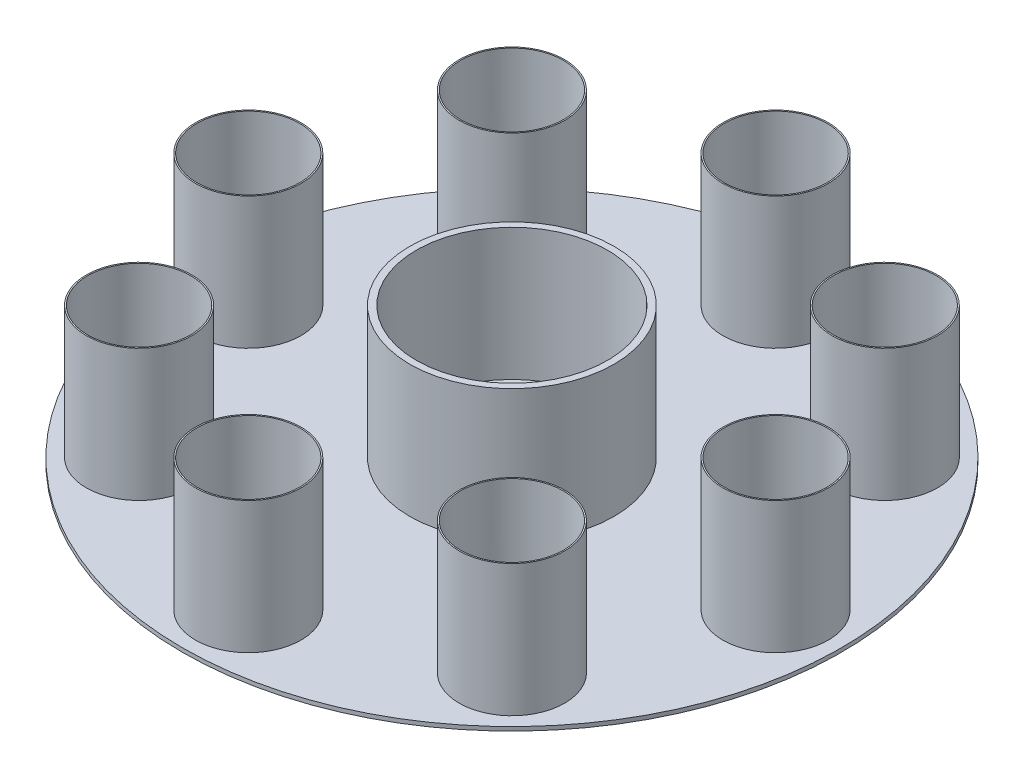
ISO-10303-21;
HEADER;
FILE_DESCRIPTION(('STEP AP214'),'2;1');
FILE_NAME('part.step','',(''),(''),'','','');
FILE_SCHEMA(('AUTOMOTIVE_DESIGN { 1 0 10303 214 1 1 1 1 }'));
ENDSEC;
DATA;
#1=APPLICATION_CONTEXT('core data for automotive mechanical design processes');
#2=APPLICATION_PROTOCOL_DEFINITION('international standard','automotive_design',2000,#1);
#3=PRODUCT_CONTEXT('',#1,'mechanical');
#4=PRODUCT('Part','Part','',(#3));
#5=PRODUCT_RELATED_PRODUCT_CATEGORY('part','',(#4));
#6=PRODUCT_DEFINITION_FORMATION('','',#4);
#7=PRODUCT_DEFINITION_CONTEXT('part definition',#1,'design');
#8=PRODUCT_DEFINITION('design','',#6,#7);
#9=PRODUCT_DEFINITION_SHAPE('','',#8);
#10=(LENGTH_UNIT() NAMED_UNIT(*) SI_UNIT(.MILLI.,.METRE.));
#11=(NAMED_UNIT(*) PLANE_ANGLE_UNIT() SI_UNIT($,.RADIAN.));
#12=(NAMED_UNIT(*) SI_UNIT($,.STERADIAN.) SOLID_ANGLE_UNIT());
#13=UNCERTAINTY_MEASURE_WITH_UNIT(LENGTH_MEASURE(1.E-05),#10,'distance_accuracy_value','');
#14=(GEOMETRIC_REPRESENTATION_CONTEXT(3) GLOBAL_UNCERTAINTY_ASSIGNED_CONTEXT((#13)) GLOBAL_UNIT_ASSIGNED_CONTEXT((#10,
#11,#12)) REPRESENTATION_CONTEXT('',''));
#15=CARTESIAN_POINT('',(0.,0.,0.));
#16=DIRECTION('',(0.,0.,1.));
#17=DIRECTION('',(1.,0.,0.));
#18=AXIS2_PLACEMENT_3D('',#15,#16,#17);
#19=CARTESIAN_POINT('',(0.,3.,0.));
#20=DIRECTION('',(0.,1.,0.));
#21=DIRECTION('',(0.,0.,1.));
#22=AXIS2_PLACEMENT_3D('',#19,#20,#21);
#23=PLANE('',#22);
#24=CARTESIAN_POINT('',(0.,3.,0.));
#25=DIRECTION('',(0.,1.,0.));
#26=DIRECTION('',(0.,0.,1.));
#27=AXIS2_PLACEMENT_3D('',#24,#25,#26);
#28=CIRCLE('',#27,77.5);
#29=CARTESIAN_POINT('',(0.,3.,77.5));
#30=VERTEX_POINT('',#29);
#31=EDGE_CURVE('E149',#30,#30,#28,.T.);
#32=ORIENTED_EDGE('',*,*,#31,.F.);
#33=EDGE_LOOP('',(#32));
#34=FACE_BOUND('',#33,.T.);
#35=CARTESIAN_POINT('',(-200.,3.,6.66133814775094E-13));
#36=DIRECTION('',(0.,1.,0.));
#37=DIRECTION('',(0.,0.,1.));
#38=AXIS2_PLACEMENT_3D('',#35,#36,#37);
#39=CIRCLE('',#38,40.);
#40=CARTESIAN_POINT('',(-200.,3.,40.0000000000007));
#41=VERTEX_POINT('',#40);
#42=EDGE_CURVE('E131',#41,#41,#39,.T.);
#43=ORIENTED_EDGE('',*,*,#42,.F.);
#44=EDGE_LOOP('',(#43));
#45=FACE_BOUND('',#44,.T.);
#46=CARTESIAN_POINT('',(1.38777878078145E-12,3.,200.));
#47=DIRECTION('',(0.,1.,0.));
#48=DIRECTION('',(0.,0.,1.));
#49=AXIS2_PLACEMENT_3D('',#46,#47,#48);
#50=CIRCLE('',#49,40.);
#51=CARTESIAN_POINT('',(1.38777878078145E-12,3.,240.));
#52=VERTEX_POINT('',#51);
#53=EDGE_CURVE('E113',#52,#52,#50,.T.);
#54=ORIENTED_EDGE('',*,*,#53,.F.);
#55=EDGE_LOOP('',(#54));
#56=FACE_BOUND('',#55,.T.);
#57=CARTESIAN_POINT('',(200.,3.,6.66133814775094E-13));
#58=DIRECTION('',(0.,1.,0.));
#59=DIRECTION('',(0.,0.,1.));
#60=AXIS2_PLACEMENT_3D('',#57,#58,#59);
#61=CIRCLE('',#60,40.);
#62=CARTESIAN_POINT('',(200.,3.,40.0000000000007));
#63=VERTEX_POINT('',#62);
#64=EDGE_CURVE('E95',#63,#63,#61,.T.);
#65=ORIENTED_EDGE('',*,*,#64,.F.);
#66=EDGE_LOOP('',(#65));
#67=FACE_BOUND('',#66,.T.);
#68=CARTESIAN_POINT('',(0.,3.,-200.));
#69=DIRECTION('',(0.,1.,0.));
#70=DIRECTION('',(0.,0.,1.));
#71=AXIS2_PLACEMENT_3D('',#68,#69,#70);
#72=CIRCLE('',#71,40.);
#73=CARTESIAN_POINT('',(0.,3.,-160.));
#74=VERTEX_POINT('',#73);
#75=EDGE_CURVE('E77',#74,#74,#72,.T.);
#76=ORIENTED_EDGE('',*,*,#75,.F.);
#77=EDGE_LOOP('',(#76));
#78=FACE_BOUND('',#77,.T.);
#79=CARTESIAN_POINT('',(0.,3.,0.));
#80=DIRECTION('',(0.,1.,0.));
#81=DIRECTION('',(0.,0.,1.));
#82=AXIS2_PLACEMENT_3D('',#79,#80,#81);
#83=CIRCLE('',#82,250.);
#84=CARTESIAN_POINT('',(0.,3.,250.));
#85=VERTEX_POINT('',#84);
#86=EDGE_CURVE('E42',#85,#85,#83,.T.);
#87=ORIENTED_EDGE('',*,*,#86,.T.);
#88=EDGE_LOOP('',(#87));
#89=FACE_BOUND('',#88,.T.);
#90=CARTESIAN_POINT('',(141.42135623731,3.,-141.421356237309));
#91=DIRECTION('',(0.,1.,0.));
#92=DIRECTION('',(0.,0.,1.));
#93=AXIS2_PLACEMENT_3D('',#90,#91,#92);
#94=CIRCLE('',#93,40.);
#95=CARTESIAN_POINT('',(141.42135623731,3.,-101.421356237309));
#96=VERTEX_POINT('',#95);
#97=EDGE_CURVE('E86',#96,#96,#94,.T.);
#98=ORIENTED_EDGE('',*,*,#97,.F.);
#99=EDGE_LOOP('',(#98));
#100=FACE_BOUND('',#99,.T.);
#101=CARTESIAN_POINT('',(141.42135623731,3.,141.421356237309));
#102=DIRECTION('',(0.,1.,0.));
#103=DIRECTION('',(0.,0.,1.));
#104=AXIS2_PLACEMENT_3D('',#101,#102,#103);
#105=CIRCLE('',#104,40.);
#106=CARTESIAN_POINT('',(141.42135623731,3.,181.421356237309));
#107=VERTEX_POINT('',#106);
#108=EDGE_CURVE('E104',#107,#107,#105,.T.);
#109=ORIENTED_EDGE('',*,*,#108,.F.);
#110=EDGE_LOOP('',(#109));
#111=FACE_BOUND('',#110,.T.);
#112=CARTESIAN_POINT('',(-141.42135623731,3.,141.421356237309));
#113=DIRECTION('',(0.,1.,0.));
#114=DIRECTION('',(0.,0.,1.));
#115=AXIS2_PLACEMENT_3D('',#112,#113,#114);
#116=CIRCLE('',#115,40.);
#117=CARTESIAN_POINT('',(-141.42135623731,3.,181.421356237309));
#118=VERTEX_POINT('',#117);
#119=EDGE_CURVE('E122',#118,#118,#116,.T.);
#120=ORIENTED_EDGE('',*,*,#119,.F.);
#121=EDGE_LOOP('',(#120));
#122=FACE_BOUND('',#121,.T.);
#123=CARTESIAN_POINT('',(-141.42135623731,3.,-141.421356237309));
#124=DIRECTION('',(0.,1.,0.));
#125=DIRECTION('',(0.,0.,1.));
#126=AXIS2_PLACEMENT_3D('',#123,#124,#125);
#127=CIRCLE('',#126,40.);
#128=CARTESIAN_POINT('',(-141.42135623731,3.,-101.421356237309));
#129=VERTEX_POINT('',#128);
#130=EDGE_CURVE('E140',#129,#129,#127,.T.);
#131=ORIENTED_EDGE('',*,*,#130,.F.);
#132=EDGE_LOOP('',(#131));
#133=FACE_BOUND('',#132,.T.);
#134=ADVANCED_FACE('F35',(#34,#45,#56,#67,#78,#89,#100,#111,#122,#133),#23,.T.);
#135=CARTESIAN_POINT('',(0.,0.,0.));
#136=DIRECTION('',(0.,1.,0.));
#137=DIRECTION('',(0.,0.,1.));
#138=AXIS2_PLACEMENT_3D('',#135,#136,#137);
#139=PLANE('',#138);
#140=CARTESIAN_POINT('',(0.,0.,0.));
#141=DIRECTION('',(0.,1.,0.));
#142=DIRECTION('',(0.,0.,1.));
#143=AXIS2_PLACEMENT_3D('',#140,#141,#142);
#144=CIRCLE('',#143,250.);
#145=CARTESIAN_POINT('',(0.,0.,250.));
#146=VERTEX_POINT('',#145);
#147=EDGE_CURVE('E46',#146,#146,#144,.T.);
#148=ORIENTED_EDGE('',*,*,#147,.F.);
#149=EDGE_LOOP('',(#148));
#150=FACE_BOUND('',#149,.T.);
#151=CARTESIAN_POINT('',(141.42135623731,0.,-141.421356237309));
#152=DIRECTION('',(0.,1.,0.));
#153=DIRECTION('',(0.,0.,1.));
#154=AXIS2_PLACEMENT_3D('',#151,#152,#153);
#155=CIRCLE('',#154,39.);
#156=CARTESIAN_POINT('',(141.42135623731,0.,-102.421356237309));
#157=VERTEX_POINT('',#156);
#158=EDGE_CURVE('E51',#157,#157,#155,.T.);
#159=ORIENTED_EDGE('',*,*,#158,.T.);
#160=EDGE_LOOP('',(#159));
#161=FACE_BOUND('',#160,.T.);
#162=CARTESIAN_POINT('',(-141.42135623731,0.,-141.421356237309));
#163=DIRECTION('',(0.,1.,0.));
#164=DIRECTION('',(0.,0.,-1.));
#165=AXIS2_PLACEMENT_3D('',#162,#163,#164);
#166=CIRCLE('',#165,39.);
#167=CARTESIAN_POINT('',(-141.42135623731,0.,-180.421356237309));
#168=VERTEX_POINT('',#167);
#169=EDGE_CURVE('E55',#168,#168,#166,.T.);
#170=ORIENTED_EDGE('',*,*,#169,.T.);
#171=EDGE_LOOP('',(#170));
#172=FACE_BOUND('',#171,.T.);
#173=CARTESIAN_POINT('',(-141.42135623731,0.,141.421356237309));
#174=DIRECTION('',(0.,1.,0.));
#175=DIRECTION('',(0.,0.,1.));
#176=AXIS2_PLACEMENT_3D('',#173,#174,#175);
#177=CIRCLE('',#176,39.);
#178=CARTESIAN_POINT('',(-141.42135623731,0.,180.421356237309));
#179=VERTEX_POINT('',#178);
#180=EDGE_CURVE('E58',#179,#179,#177,.T.);
#181=ORIENTED_EDGE('',*,*,#180,.T.);
#182=EDGE_LOOP('',(#181));
#183=FACE_BOUND('',#182,.T.);
#184=CARTESIAN_POINT('',(141.42135623731,0.,141.421356237309));
#185=DIRECTION('',(0.,1.,0.));
#186=DIRECTION('',(0.,0.,-1.));
#187=AXIS2_PLACEMENT_3D('',#184,#185,#186);
#188=CIRCLE('',#187,39.);
#189=CARTESIAN_POINT('',(141.42135623731,0.,102.421356237309));
#190=VERTEX_POINT('',#189);
#191=EDGE_CURVE('E61',#190,#190,#188,.T.);
#192=ORIENTED_EDGE('',*,*,#191,.T.);
#193=EDGE_LOOP('',(#192));
#194=FACE_BOUND('',#193,.T.);
#195=CARTESIAN_POINT('',(0.,0.,-200.));
#196=DIRECTION('',(0.,1.,0.));
#197=DIRECTION('',(0.,0.,1.));
#198=AXIS2_PLACEMENT_3D('',#195,#196,#197);
#199=CIRCLE('',#198,39.);
#200=CARTESIAN_POINT('',(0.,0.,-161.));
#201=VERTEX_POINT('',#200);
#202=EDGE_CURVE('E64',#201,#201,#199,.T.);
#203=ORIENTED_EDGE('',*,*,#202,.T.);
#204=EDGE_LOOP('',(#203));
#205=FACE_BOUND('',#204,.T.);
#206=CARTESIAN_POINT('',(200.,0.,6.66133814775094E-13));
#207=DIRECTION('',(0.,1.,0.));
#208=DIRECTION('',(0.,0.,-1.));
#209=AXIS2_PLACEMENT_3D('',#206,#207,#208);
#210=CIRCLE('',#209,39.);
#211=CARTESIAN_POINT('',(200.,0.,-38.9999999999993));
#212=VERTEX_POINT('',#211);
#213=EDGE_CURVE('E67',#212,#212,#210,.T.);
#214=ORIENTED_EDGE('',*,*,#213,.T.);
#215=EDGE_LOOP('',(#214));
#216=FACE_BOUND('',#215,.T.);
#217=CARTESIAN_POINT('',(1.38777878078145E-12,0.,200.));
#218=DIRECTION('',(0.,1.,0.));
#219=DIRECTION('',(0.,0.,1.));
#220=AXIS2_PLACEMENT_3D('',#217,#218,#219);
#221=CIRCLE('',#220,39.);
#222=CARTESIAN_POINT('',(1.38777878078145E-12,0.,239.));
#223=VERTEX_POINT('',#222);
#224=EDGE_CURVE('E70',#223,#223,#221,.T.);
#225=ORIENTED_EDGE('',*,*,#224,.T.);
#226=EDGE_LOOP('',(#225));
#227=FACE_BOUND('',#226,.T.);
#228=CARTESIAN_POINT('',(-200.,0.,6.66133814775094E-13));
#229=DIRECTION('',(0.,1.,0.));
#230=DIRECTION('',(0.,0.,1.));
#231=AXIS2_PLACEMENT_3D('',#228,#229,#230);
#232=CIRCLE('',#231,39.);
#233=CARTESIAN_POINT('',(-200.,0.,39.0000000000007));
#234=VERTEX_POINT('',#233);
#235=EDGE_CURVE('E73',#234,#234,#232,.T.);
#236=ORIENTED_EDGE('',*,*,#235,.T.);
#237=EDGE_LOOP('',(#236));
#238=FACE_BOUND('',#237,.T.);
#239=ADVANCED_FACE('F177',(#150,#161,#172,#183,#194,#205,#216,#227,#238),#139,.F.);
#240=CARTESIAN_POINT('',(0.,3.,0.));
#241=DIRECTION('',(0.,-1.,0.));
#242=DIRECTION('',(0.,0.,-1.));
#243=AXIS2_PLACEMENT_3D('',#240,#241,#242);
#244=CYLINDRICAL_SURFACE('',#243,250.);
#245=ORIENTED_EDGE('',*,*,#86,.F.);
#246=EDGE_LOOP('',(#245));
#247=FACE_BOUND('',#246,.T.);
#248=ORIENTED_EDGE('',*,*,#147,.T.);
#249=EDGE_LOOP('',(#248));
#250=FACE_BOUND('',#249,.T.);
#251=ADVANCED_FACE('F37',(#247,#250),#244,.T.);
#252=CARTESIAN_POINT('',(141.42135623731,3.,-141.421356237309));
#253=DIRECTION('',(0.,-1.,0.));
#254=DIRECTION('',(0.,0.,-1.));
#255=AXIS2_PLACEMENT_3D('',#252,#253,#254);
#256=CYLINDRICAL_SURFACE('',#255,39.);
#257=ORIENTED_EDGE('',*,*,#158,.F.);
#258=EDGE_LOOP('',(#257));
#259=FACE_BOUND('',#258,.T.);
#260=CARTESIAN_POINT('',(141.42135623731,103.,-141.421356237309));
#261=DIRECTION('',(0.,1.,0.));
#262=DIRECTION('',(0.,0.,1.));
#263=AXIS2_PLACEMENT_3D('',#260,#261,#262);
#264=CIRCLE('',#263,39.);
#265=CARTESIAN_POINT('',(141.42135623731,103.,-102.421356237309));
#266=VERTEX_POINT('',#265);
#267=EDGE_CURVE('E89',#266,#266,#264,.T.);
#268=ORIENTED_EDGE('',*,*,#267,.T.);
#269=EDGE_LOOP('',(#268));
#270=FACE_BOUND('',#269,.T.);
#271=ADVANCED_FACE('F440',(#259,#270),#256,.F.);
#272=CARTESIAN_POINT('',(-141.42135623731,3.,-141.421356237309));
#273=DIRECTION('',(0.,-1.,0.));
#274=DIRECTION('',(0.,0.,-1.));
#275=AXIS2_PLACEMENT_3D('',#272,#273,#274);
#276=CYLINDRICAL_SURFACE('',#275,39.);
#277=ORIENTED_EDGE('',*,*,#169,.F.);
#278=EDGE_LOOP('',(#277));
#279=FACE_BOUND('',#278,.T.);
#280=CARTESIAN_POINT('',(-141.42135623731,103.,-141.421356237309));
#281=DIRECTION('',(0.,1.,0.));
#282=DIRECTION('',(0.,0.,1.));
#283=AXIS2_PLACEMENT_3D('',#280,#281,#282);
#284=CIRCLE('',#283,39.);
#285=CARTESIAN_POINT('',(-141.42135623731,103.,-102.421356237309));
#286=VERTEX_POINT('',#285);
#287=EDGE_CURVE('E143',#286,#286,#284,.T.);
#288=ORIENTED_EDGE('',*,*,#287,.T.);
#289=EDGE_LOOP('',(#288));
#290=FACE_BOUND('',#289,.T.);
#291=ADVANCED_FACE('F429',(#279,#290),#276,.F.);
#292=CARTESIAN_POINT('',(-141.42135623731,3.,141.421356237309));
#293=DIRECTION('',(0.,-1.,0.));
#294=DIRECTION('',(0.,0.,-1.));
#295=AXIS2_PLACEMENT_3D('',#292,#293,#294);
#296=CYLINDRICAL_SURFACE('',#295,39.);
#297=ORIENTED_EDGE('',*,*,#180,.F.);
#298=EDGE_LOOP('',(#297));
#299=FACE_BOUND('',#298,.T.);
#300=CARTESIAN_POINT('',(-141.42135623731,103.,141.421356237309));
#301=DIRECTION('',(0.,1.,0.));
#302=DIRECTION('',(0.,0.,1.));
#303=AXIS2_PLACEMENT_3D('',#300,#301,#302);
#304=CIRCLE('',#303,39.);
#305=CARTESIAN_POINT('',(-141.42135623731,103.,180.421356237309));
#306=VERTEX_POINT('',#305);
#307=EDGE_CURVE('E125',#306,#306,#304,.T.);
#308=ORIENTED_EDGE('',*,*,#307,.T.);
#309=EDGE_LOOP('',(#308));
#310=FACE_BOUND('',#309,.T.);
#311=ADVANCED_FACE('F418',(#299,#310),#296,.F.);
#312=CARTESIAN_POINT('',(141.42135623731,3.,141.421356237309));
#313=DIRECTION('',(0.,-1.,0.));
#314=DIRECTION('',(0.,0.,-1.));
#315=AXIS2_PLACEMENT_3D('',#312,#313,#314);
#316=CYLINDRICAL_SURFACE('',#315,39.);
#317=ORIENTED_EDGE('',*,*,#191,.F.);
#318=EDGE_LOOP('',(#317));
#319=FACE_BOUND('',#318,.T.);
#320=CARTESIAN_POINT('',(141.42135623731,103.,141.421356237309));
#321=DIRECTION('',(0.,1.,0.));
#322=DIRECTION('',(0.,0.,1.));
#323=AXIS2_PLACEMENT_3D('',#320,#321,#322);
#324=CIRCLE('',#323,39.);
#325=CARTESIAN_POINT('',(141.42135623731,103.,180.421356237309));
#326=VERTEX_POINT('',#325);
#327=EDGE_CURVE('E107',#326,#326,#324,.T.);
#328=ORIENTED_EDGE('',*,*,#327,.T.);
#329=EDGE_LOOP('',(#328));
#330=FACE_BOUND('',#329,.T.);
#331=ADVANCED_FACE('F407',(#319,#330),#316,.F.);
#332=CARTESIAN_POINT('',(0.,3.,-200.));
#333=DIRECTION('',(0.,-1.,0.));
#334=DIRECTION('',(0.,0.,-1.));
#335=AXIS2_PLACEMENT_3D('',#332,#333,#334);
#336=CYLINDRICAL_SURFACE('',#335,39.);
#337=ORIENTED_EDGE('',*,*,#202,.F.);
#338=EDGE_LOOP('',(#337));
#339=FACE_BOUND('',#338,.T.);
#340=CARTESIAN_POINT('',(0.,103.,-200.));
#341=DIRECTION('',(0.,1.,0.));
#342=DIRECTION('',(0.,0.,1.));
#343=AXIS2_PLACEMENT_3D('',#340,#341,#342);
#344=CIRCLE('',#343,39.);
#345=CARTESIAN_POINT('',(0.,103.,-161.));
#346=VERTEX_POINT('',#345);
#347=EDGE_CURVE('E80',#346,#346,#344,.T.);
#348=ORIENTED_EDGE('',*,*,#347,.T.);
#349=EDGE_LOOP('',(#348));
#350=FACE_BOUND('',#349,.T.);
#351=ADVANCED_FACE('F396',(#339,#350),#336,.F.);
#352=CARTESIAN_POINT('',(200.,3.,6.66133814775094E-13));
#353=DIRECTION('',(0.,-1.,0.));
#354=DIRECTION('',(0.,0.,-1.));
#355=AXIS2_PLACEMENT_3D('',#352,#353,#354);
#356=CYLINDRICAL_SURFACE('',#355,39.);
#357=ORIENTED_EDGE('',*,*,#213,.F.);
#358=EDGE_LOOP('',(#357));
#359=FACE_BOUND('',#358,.T.);
#360=CARTESIAN_POINT('',(200.,103.,6.66133814775094E-13));
#361=DIRECTION('',(0.,1.,0.));
#362=DIRECTION('',(0.,0.,1.));
#363=AXIS2_PLACEMENT_3D('',#360,#361,#362);
#364=CIRCLE('',#363,39.);
#365=CARTESIAN_POINT('',(200.,103.,39.0000000000007));
#366=VERTEX_POINT('',#365);
#367=EDGE_CURVE('E98',#366,#366,#364,.T.);
#368=ORIENTED_EDGE('',*,*,#367,.T.);
#369=EDGE_LOOP('',(#368));
#370=FACE_BOUND('',#369,.T.);
#371=ADVANCED_FACE('F385',(#359,#370),#356,.F.);
#372=CARTESIAN_POINT('',(1.38777878078145E-12,3.,200.));
#373=DIRECTION('',(0.,-1.,0.));
#374=DIRECTION('',(0.,0.,-1.));
#375=AXIS2_PLACEMENT_3D('',#372,#373,#374);
#376=CYLINDRICAL_SURFACE('',#375,39.);
#377=ORIENTED_EDGE('',*,*,#224,.F.);
#378=EDGE_LOOP('',(#377));
#379=FACE_BOUND('',#378,.T.);
#380=CARTESIAN_POINT('',(1.38777878078145E-12,103.,200.));
#381=DIRECTION('',(0.,1.,0.));
#382=DIRECTION('',(0.,0.,1.));
#383=AXIS2_PLACEMENT_3D('',#380,#381,#382);
#384=CIRCLE('',#383,39.);
#385=CARTESIAN_POINT('',(1.38777878078145E-12,103.,239.));
#386=VERTEX_POINT('',#385);
#387=EDGE_CURVE('E116',#386,#386,#384,.T.);
#388=ORIENTED_EDGE('',*,*,#387,.T.);
#389=EDGE_LOOP('',(#388));
#390=FACE_BOUND('',#389,.T.);
#391=ADVANCED_FACE('F375',(#379,#390),#376,.F.);
#392=CARTESIAN_POINT('',(-200.,3.,6.66133814775094E-13));
#393=DIRECTION('',(0.,-1.,0.));
#394=DIRECTION('',(0.,0.,-1.));
#395=AXIS2_PLACEMENT_3D('',#392,#393,#394);
#396=CYLINDRICAL_SURFACE('',#395,39.);
#397=ORIENTED_EDGE('',*,*,#235,.F.);
#398=EDGE_LOOP('',(#397));
#399=FACE_BOUND('',#398,.T.);
#400=CARTESIAN_POINT('',(-200.,103.,6.66133814775094E-13));
#401=DIRECTION('',(0.,1.,0.));
#402=DIRECTION('',(0.,0.,1.));
#403=AXIS2_PLACEMENT_3D('',#400,#401,#402);
#404=CIRCLE('',#403,39.);
#405=CARTESIAN_POINT('',(-200.,103.,39.0000000000007));
#406=VERTEX_POINT('',#405);
#407=EDGE_CURVE('E134',#406,#406,#404,.T.);
#408=ORIENTED_EDGE('',*,*,#407,.T.);
#409=EDGE_LOOP('',(#408));
#410=FACE_BOUND('',#409,.T.);
#411=ADVANCED_FACE('F365',(#399,#410),#396,.F.);
#412=CARTESIAN_POINT('',(0.,103.,-200.));
#413=DIRECTION('',(0.,1.,0.));
#414=DIRECTION('',(0.,0.,1.));
#415=AXIS2_PLACEMENT_3D('',#412,#413,#414);
#416=PLANE('',#415);
#417=CARTESIAN_POINT('',(0.,103.,-200.));
#418=DIRECTION('',(0.,1.,0.));
#419=DIRECTION('',(0.,0.,1.));
#420=AXIS2_PLACEMENT_3D('',#417,#418,#419);
#421=CIRCLE('',#420,40.);
#422=CARTESIAN_POINT('',(0.,103.,-160.));
#423=VERTEX_POINT('',#422);
#424=EDGE_CURVE('E76',#423,#423,#421,.T.);
#425=ORIENTED_EDGE('',*,*,#424,.T.);
#426=EDGE_LOOP('',(#425));
#427=FACE_BOUND('',#426,.T.);
#428=ORIENTED_EDGE('',*,*,#347,.F.);
#429=EDGE_LOOP('',(#428));
#430=FACE_BOUND('',#429,.T.);
#431=ADVANCED_FACE('F355',(#427,#430),#416,.T.);
#432=CARTESIAN_POINT('',(0.,103.,-200.));
#433=DIRECTION('',(0.,-1.,0.));
#434=DIRECTION('',(0.,0.,-1.));
#435=AXIS2_PLACEMENT_3D('',#432,#433,#434);
#436=CYLINDRICAL_SURFACE('',#435,40.);
#437=ORIENTED_EDGE('',*,*,#424,.F.);
#438=EDGE_LOOP('',(#437));
#439=FACE_BOUND('',#438,.T.);
#440=ORIENTED_EDGE('',*,*,#75,.T.);
#441=EDGE_LOOP('',(#440));
#442=FACE_BOUND('',#441,.T.);
#443=ADVANCED_FACE('F345',(#439,#442),#436,.T.);
#444=CARTESIAN_POINT('',(141.42135623731,103.,-141.421356237309));
#445=DIRECTION('',(0.,1.,0.));
#446=DIRECTION('',(0.,0.,1.));
#447=AXIS2_PLACEMENT_3D('',#444,#445,#446);
#448=PLANE('',#447);
#449=CARTESIAN_POINT('',(141.42135623731,103.,-141.421356237309));
#450=DIRECTION('',(0.,1.,0.));
#451=DIRECTION('',(0.,0.,1.));
#452=AXIS2_PLACEMENT_3D('',#449,#450,#451);
#453=CIRCLE('',#452,40.);
#454=CARTESIAN_POINT('',(141.42135623731,103.,-101.421356237309));
#455=VERTEX_POINT('',#454);
#456=EDGE_CURVE('E85',#455,#455,#453,.T.);
#457=ORIENTED_EDGE('',*,*,#456,.T.);
#458=EDGE_LOOP('',(#457));
#459=FACE_BOUND('',#458,.T.);
#460=ORIENTED_EDGE('',*,*,#267,.F.);
#461=EDGE_LOOP('',(#460));
#462=FACE_BOUND('',#461,.T.);
#463=ADVANCED_FACE('F335',(#459,#462),#448,.T.);
#464=CARTESIAN_POINT('',(141.42135623731,103.,-141.421356237309));
#465=DIRECTION('',(0.,-1.,0.));
#466=DIRECTION('',(0.,0.,-1.));
#467=AXIS2_PLACEMENT_3D('',#464,#465,#466);
#468=CYLINDRICAL_SURFACE('',#467,40.);
#469=ORIENTED_EDGE('',*,*,#456,.F.);
#470=EDGE_LOOP('',(#469));
#471=FACE_BOUND('',#470,.T.);
#472=ORIENTED_EDGE('',*,*,#97,.T.);
#473=EDGE_LOOP('',(#472));
#474=FACE_BOUND('',#473,.T.);
#475=ADVANCED_FACE('F325',(#471,#474),#468,.T.);
#476=CARTESIAN_POINT('',(200.,103.,6.66133814775094E-13));
#477=DIRECTION('',(0.,1.,0.));
#478=DIRECTION('',(0.,0.,1.));
#479=AXIS2_PLACEMENT_3D('',#476,#477,#478);
#480=PLANE('',#479);
#481=CARTESIAN_POINT('',(200.,103.,6.66133814775094E-13));
#482=DIRECTION('',(0.,1.,0.));
#483=DIRECTION('',(0.,0.,1.));
#484=AXIS2_PLACEMENT_3D('',#481,#482,#483);
#485=CIRCLE('',#484,40.);
#486=CARTESIAN_POINT('',(200.,103.,40.0000000000007));
#487=VERTEX_POINT('',#486);
#488=EDGE_CURVE('E94',#487,#487,#485,.T.);
#489=ORIENTED_EDGE('',*,*,#488,.T.);
#490=EDGE_LOOP('',(#489));
#491=FACE_BOUND('',#490,.T.);
#492=ORIENTED_EDGE('',*,*,#367,.F.);
#493=EDGE_LOOP('',(#492));
#494=FACE_BOUND('',#493,.T.);
#495=ADVANCED_FACE('F315',(#491,#494),#480,.T.);
#496=CARTESIAN_POINT('',(200.,103.,6.66133814775094E-13));
#497=DIRECTION('',(0.,-1.,0.));
#498=DIRECTION('',(0.,0.,-1.));
#499=AXIS2_PLACEMENT_3D('',#496,#497,#498);
#500=CYLINDRICAL_SURFACE('',#499,40.);
#501=ORIENTED_EDGE('',*,*,#488,.F.);
#502=EDGE_LOOP('',(#501));
#503=FACE_BOUND('',#502,.T.);
#504=ORIENTED_EDGE('',*,*,#64,.T.);
#505=EDGE_LOOP('',(#504));
#506=FACE_BOUND('',#505,.T.);
#507=ADVANCED_FACE('F305',(#503,#506),#500,.T.);
#508=CARTESIAN_POINT('',(141.42135623731,103.,141.421356237309));
#509=DIRECTION('',(0.,1.,0.));
#510=DIRECTION('',(0.,0.,1.));
#511=AXIS2_PLACEMENT_3D('',#508,#509,#510);
#512=PLANE('',#511);
#513=CARTESIAN_POINT('',(141.42135623731,103.,141.421356237309));
#514=DIRECTION('',(0.,1.,0.));
#515=DIRECTION('',(0.,0.,1.));
#516=AXIS2_PLACEMENT_3D('',#513,#514,#515);
#517=CIRCLE('',#516,40.);
#518=CARTESIAN_POINT('',(141.42135623731,103.,181.421356237309));
#519=VERTEX_POINT('',#518);
#520=EDGE_CURVE('E103',#519,#519,#517,.T.);
#521=ORIENTED_EDGE('',*,*,#520,.T.);
#522=EDGE_LOOP('',(#521));
#523=FACE_BOUND('',#522,.T.);
#524=ORIENTED_EDGE('',*,*,#327,.F.);
#525=EDGE_LOOP('',(#524));
#526=FACE_BOUND('',#525,.T.);
#527=ADVANCED_FACE('F295',(#523,#526),#512,.T.);
#528=CARTESIAN_POINT('',(141.42135623731,103.,141.421356237309));
#529=DIRECTION('',(0.,-1.,0.));
#530=DIRECTION('',(0.,0.,-1.));
#531=AXIS2_PLACEMENT_3D('',#528,#529,#530);
#532=CYLINDRICAL_SURFACE('',#531,40.);
#533=ORIENTED_EDGE('',*,*,#520,.F.);
#534=EDGE_LOOP('',(#533));
#535=FACE_BOUND('',#534,.T.);
#536=ORIENTED_EDGE('',*,*,#108,.T.);
#537=EDGE_LOOP('',(#536));
#538=FACE_BOUND('',#537,.T.);
#539=ADVANCED_FACE('F285',(#535,#538),#532,.T.);
#540=CARTESIAN_POINT('',(1.38777878078145E-12,103.,200.));
#541=DIRECTION('',(0.,1.,0.));
#542=DIRECTION('',(0.,0.,1.));
#543=AXIS2_PLACEMENT_3D('',#540,#541,#542);
#544=PLANE('',#543);
#545=CARTESIAN_POINT('',(1.38777878078145E-12,103.,200.));
#546=DIRECTION('',(0.,1.,0.));
#547=DIRECTION('',(0.,0.,1.));
#548=AXIS2_PLACEMENT_3D('',#545,#546,#547);
#549=CIRCLE('',#548,40.);
#550=CARTESIAN_POINT('',(1.38777878078145E-12,103.,240.));
#551=VERTEX_POINT('',#550);
#552=EDGE_CURVE('E112',#551,#551,#549,.T.);
#553=ORIENTED_EDGE('',*,*,#552,.T.);
#554=EDGE_LOOP('',(#553));
#555=FACE_BOUND('',#554,.T.);
#556=ORIENTED_EDGE('',*,*,#387,.F.);
#557=EDGE_LOOP('',(#556));
#558=FACE_BOUND('',#557,.T.);
#559=ADVANCED_FACE('F275',(#555,#558),#544,.T.);
#560=CARTESIAN_POINT('',(1.38777878078145E-12,103.,200.));
#561=DIRECTION('',(0.,-1.,0.));
#562=DIRECTION('',(0.,0.,-1.));
#563=AXIS2_PLACEMENT_3D('',#560,#561,#562);
#564=CYLINDRICAL_SURFACE('',#563,40.);
#565=ORIENTED_EDGE('',*,*,#552,.F.);
#566=EDGE_LOOP('',(#565));
#567=FACE_BOUND('',#566,.T.);
#568=ORIENTED_EDGE('',*,*,#53,.T.);
#569=EDGE_LOOP('',(#568));
#570=FACE_BOUND('',#569,.T.);
#571=ADVANCED_FACE('F265',(#567,#570),#564,.T.);
#572=CARTESIAN_POINT('',(-141.42135623731,103.,141.421356237309));
#573=DIRECTION('',(0.,1.,0.));
#574=DIRECTION('',(0.,0.,1.));
#575=AXIS2_PLACEMENT_3D('',#572,#573,#574);
#576=PLANE('',#575);
#577=CARTESIAN_POINT('',(-141.42135623731,103.,141.421356237309));
#578=DIRECTION('',(0.,1.,0.));
#579=DIRECTION('',(0.,0.,1.));
#580=AXIS2_PLACEMENT_3D('',#577,#578,#579);
#581=CIRCLE('',#580,40.);
#582=CARTESIAN_POINT('',(-141.42135623731,103.,181.421356237309));
#583=VERTEX_POINT('',#582);
#584=EDGE_CURVE('E121',#583,#583,#581,.T.);
#585=ORIENTED_EDGE('',*,*,#584,.T.);
#586=EDGE_LOOP('',(#585));
#587=FACE_BOUND('',#586,.T.);
#588=ORIENTED_EDGE('',*,*,#307,.F.);
#589=EDGE_LOOP('',(#588));
#590=FACE_BOUND('',#589,.T.);
#591=ADVANCED_FACE('F255',(#587,#590),#576,.T.);
#592=CARTESIAN_POINT('',(-141.42135623731,103.,141.421356237309));
#593=DIRECTION('',(0.,-1.,0.));
#594=DIRECTION('',(0.,0.,-1.));
#595=AXIS2_PLACEMENT_3D('',#592,#593,#594);
#596=CYLINDRICAL_SURFACE('',#595,40.);
#597=ORIENTED_EDGE('',*,*,#584,.F.);
#598=EDGE_LOOP('',(#597));
#599=FACE_BOUND('',#598,.T.);
#600=ORIENTED_EDGE('',*,*,#119,.T.);
#601=EDGE_LOOP('',(#600));
#602=FACE_BOUND('',#601,.T.);
#603=ADVANCED_FACE('F245',(#599,#602),#596,.T.);
#604=CARTESIAN_POINT('',(-200.,103.,6.66133814775094E-13));
#605=DIRECTION('',(0.,1.,0.));
#606=DIRECTION('',(0.,0.,1.));
#607=AXIS2_PLACEMENT_3D('',#604,#605,#606);
#608=PLANE('',#607);
#609=CARTESIAN_POINT('',(-200.,103.,6.66133814775094E-13));
#610=DIRECTION('',(0.,1.,0.));
#611=DIRECTION('',(0.,0.,1.));
#612=AXIS2_PLACEMENT_3D('',#609,#610,#611);
#613=CIRCLE('',#612,40.);
#614=CARTESIAN_POINT('',(-200.,103.,40.0000000000007));
#615=VERTEX_POINT('',#614);
#616=EDGE_CURVE('E130',#615,#615,#613,.T.);
#617=ORIENTED_EDGE('',*,*,#616,.T.);
#618=EDGE_LOOP('',(#617));
#619=FACE_BOUND('',#618,.T.);
#620=ORIENTED_EDGE('',*,*,#407,.F.);
#621=EDGE_LOOP('',(#620));
#622=FACE_BOUND('',#621,.T.);
#623=ADVANCED_FACE('F235',(#619,#622),#608,.T.);
#624=CARTESIAN_POINT('',(-200.,103.,6.66133814775094E-13));
#625=DIRECTION('',(0.,-1.,0.));
#626=DIRECTION('',(0.,0.,-1.));
#627=AXIS2_PLACEMENT_3D('',#624,#625,#626);
#628=CYLINDRICAL_SURFACE('',#627,40.);
#629=ORIENTED_EDGE('',*,*,#616,.F.);
#630=EDGE_LOOP('',(#629));
#631=FACE_BOUND('',#630,.T.);
#632=ORIENTED_EDGE('',*,*,#42,.T.);
#633=EDGE_LOOP('',(#632));
#634=FACE_BOUND('',#633,.T.);
#635=ADVANCED_FACE('F225',(#631,#634),#628,.T.);
#636=CARTESIAN_POINT('',(-141.42135623731,103.,-141.421356237309));
#637=DIRECTION('',(0.,1.,0.));
#638=DIRECTION('',(0.,0.,1.));
#639=AXIS2_PLACEMENT_3D('',#636,#637,#638);
#640=PLANE('',#639);
#641=CARTESIAN_POINT('',(-141.42135623731,103.,-141.421356237309));
#642=DIRECTION('',(0.,1.,0.));
#643=DIRECTION('',(0.,0.,1.));
#644=AXIS2_PLACEMENT_3D('',#641,#642,#643);
#645=CIRCLE('',#644,40.);
#646=CARTESIAN_POINT('',(-141.42135623731,103.,-101.421356237309));
#647=VERTEX_POINT('',#646);
#648=EDGE_CURVE('E139',#647,#647,#645,.T.);
#649=ORIENTED_EDGE('',*,*,#648,.T.);
#650=EDGE_LOOP('',(#649));
#651=FACE_BOUND('',#650,.T.);
#652=ORIENTED_EDGE('',*,*,#287,.F.);
#653=EDGE_LOOP('',(#652));
#654=FACE_BOUND('',#653,.T.);
#655=ADVANCED_FACE('F172',(#651,#654),#640,.T.);
#656=CARTESIAN_POINT('',(-141.42135623731,103.,-141.421356237309));
#657=DIRECTION('',(0.,-1.,0.));
#658=DIRECTION('',(0.,0.,-1.));
#659=AXIS2_PLACEMENT_3D('',#656,#657,#658);
#660=CYLINDRICAL_SURFACE('',#659,40.);
#661=ORIENTED_EDGE('',*,*,#648,.F.);
#662=EDGE_LOOP('',(#661));
#663=FACE_BOUND('',#662,.T.);
#664=ORIENTED_EDGE('',*,*,#130,.T.);
#665=EDGE_LOOP('',(#664));
#666=FACE_BOUND('',#665,.T.);
#667=ADVANCED_FACE('F163',(#663,#666),#660,.T.);
#668=CARTESIAN_POINT('',(0.,103.,0.));
#669=DIRECTION('',(0.,1.,0.));
#670=DIRECTION('',(0.,0.,1.));
#671=AXIS2_PLACEMENT_3D('',#668,#669,#670);
#672=PLANE('',#671);
#673=CARTESIAN_POINT('',(0.,103.,0.));
#674=DIRECTION('',(0.,1.,0.));
#675=DIRECTION('',(0.,0.,1.));
#676=AXIS2_PLACEMENT_3D('',#673,#674,#675);
#677=CIRCLE('',#676,77.5);
#678=CARTESIAN_POINT('',(0.,103.,77.5));
#679=VERTEX_POINT('',#678);
#680=EDGE_CURVE('E148',#679,#679,#677,.T.);
#681=ORIENTED_EDGE('',*,*,#680,.T.);
#682=EDGE_LOOP('',(#681));
#683=FACE_BOUND('',#682,.T.);
#684=CARTESIAN_POINT('',(0.,103.,0.));
#685=DIRECTION('',(0.,1.,0.));
#686=DIRECTION('',(0.,0.,1.));
#687=AXIS2_PLACEMENT_3D('',#684,#685,#686);
#688=CIRCLE('',#687,72.5);
#689=CARTESIAN_POINT('',(0.,103.,72.5));
#690=VERTEX_POINT('',#689);
#691=EDGE_CURVE('E152',#690,#690,#688,.T.);
#692=ORIENTED_EDGE('',*,*,#691,.F.);
#693=EDGE_LOOP('',(#692));
#694=FACE_BOUND('',#693,.T.);
#695=ADVANCED_FACE('F160',(#683,#694),#672,.T.);
#696=CARTESIAN_POINT('',(0.,103.,0.));
#697=DIRECTION('',(0.,-1.,0.));
#698=DIRECTION('',(0.,0.,-1.));
#699=AXIS2_PLACEMENT_3D('',#696,#697,#698);
#700=CYLINDRICAL_SURFACE('',#699,77.5);
#701=ORIENTED_EDGE('',*,*,#680,.F.);
#702=EDGE_LOOP('',(#701));
#703=FACE_BOUND('',#702,.T.);
#704=ORIENTED_EDGE('',*,*,#31,.T.);
#705=EDGE_LOOP('',(#704));
#706=FACE_BOUND('',#705,.T.);
#707=ADVANCED_FACE('F162',(#703,#706),#700,.T.);
#708=CARTESIAN_POINT('',(0.,103.,0.));
#709=DIRECTION('',(0.,-1.,0.));
#710=DIRECTION('',(0.,0.,-1.));
#711=AXIS2_PLACEMENT_3D('',#708,#709,#710);
#712=CYLINDRICAL_SURFACE('',#711,72.5);
#713=ORIENTED_EDGE('',*,*,#691,.T.);
#714=EDGE_LOOP('',(#713));
#715=FACE_BOUND('',#714,.T.);
#716=CARTESIAN_POINT('',(0.,3.,0.));
#717=DIRECTION('',(0.,1.,0.));
#718=DIRECTION('',(0.,0.,1.));
#719=AXIS2_PLACEMENT_3D('',#716,#717,#718);
#720=CIRCLE('',#719,72.5);
#721=CARTESIAN_POINT('',(0.,3.,72.5));
#722=VERTEX_POINT('',#721);
#723=EDGE_CURVE('E10',#722,#722,#720,.F.);
#724=ORIENTED_EDGE('',*,*,#723,.T.);
#725=EDGE_LOOP('',(#724));
#726=FACE_BOUND('',#725,.T.);
#727=ADVANCED_FACE('F158',(#715,#726),#712,.F.);
#728=ORIENTED_EDGE('',*,*,#723,.F.);
#729=EDGE_LOOP('',(#728));
#730=FACE_BOUND('',#729,.T.);
#731=ADVANCED_FACE('F180',(#730),#23,.T.);
#732=CLOSED_SHELL('',(#134,#239,#251,#271,#291,#311,#331,#351,#371,#391,#411,#431,#443,#463,
#475,#495,#507,#527,#539,#559,#571,#591,#603,#623,#635,#655,#667,#695,#707,#727,#731));
#733=MANIFOLD_SOLID_BREP('B2',#732);
#734=ADVANCED_BREP_SHAPE_REPRESENTATION('',(#18,#733),#14);
#735=SHAPE_DEFINITION_REPRESENTATION(#9,#734);
ENDSEC;
END-ISO-10303-21;
